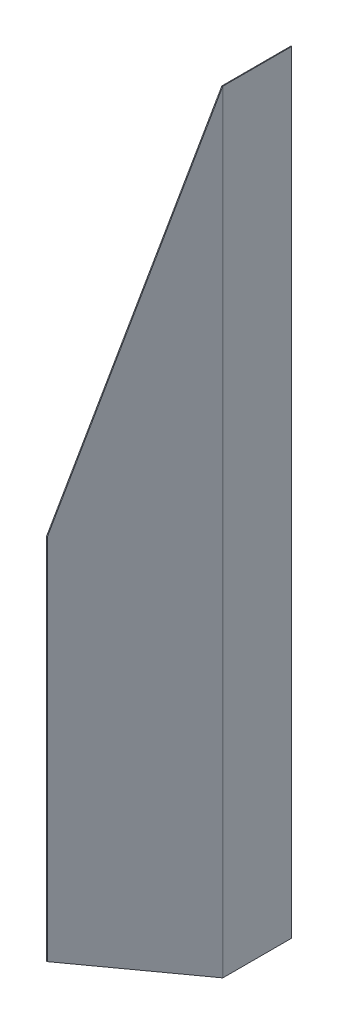
ISO-10303-21;
HEADER;
FILE_DESCRIPTION(('STEP AP214'),'2;1');
FILE_NAME('part.step','',(''),(''),'','','');
FILE_SCHEMA(('AUTOMOTIVE_DESIGN { 1 0 10303 214 1 1 1 1 }'));
ENDSEC;
DATA;
#1=APPLICATION_CONTEXT('core data for automotive mechanical design processes');
#2=APPLICATION_PROTOCOL_DEFINITION('international standard','automotive_design',2000,#1);
#3=PRODUCT_CONTEXT('',#1,'mechanical');
#4=PRODUCT('Part','Part','',(#3));
#5=PRODUCT_RELATED_PRODUCT_CATEGORY('part','',(#4));
#6=PRODUCT_DEFINITION_FORMATION('','',#4);
#7=PRODUCT_DEFINITION_CONTEXT('part definition',#1,'design');
#8=PRODUCT_DEFINITION('design','',#6,#7);
#9=PRODUCT_DEFINITION_SHAPE('','',#8);
#10=(LENGTH_UNIT() NAMED_UNIT(*) SI_UNIT(.MILLI.,.METRE.));
#11=(NAMED_UNIT(*) PLANE_ANGLE_UNIT() SI_UNIT($,.RADIAN.));
#12=(NAMED_UNIT(*) SI_UNIT($,.STERADIAN.) SOLID_ANGLE_UNIT());
#13=UNCERTAINTY_MEASURE_WITH_UNIT(LENGTH_MEASURE(1.E-05),#10,'distance_accuracy_value','');
#14=(GEOMETRIC_REPRESENTATION_CONTEXT(3) GLOBAL_UNCERTAINTY_ASSIGNED_CONTEXT((#13)) GLOBAL_UNIT_ASSIGNED_CONTEXT((#10,
#11,#12)) REPRESENTATION_CONTEXT('',''));
#15=CARTESIAN_POINT('',(0.,0.,0.));
#16=DIRECTION('',(0.,0.,1.));
#17=DIRECTION('',(1.,0.,0.));
#18=AXIS2_PLACEMENT_3D('',#15,#16,#17);
#19=CARTESIAN_POINT('',(-3.20750439329976,840.,-49.4876398968316));
#20=DIRECTION('',(0.939692620785909,0.,-0.342020143325666));
#21=DIRECTION('',(-0.342020143325666,0.,-0.93969262078591));
#22=AXIS2_PLACEMENT_3D('',#19,#20,#21);
#23=PLANE('',#22);
#24=DIRECTION('',(0.281664999513488,0.567267835166944,0.773868226014013));
#25=VECTOR('',#24,1.);
#26=CARTESIAN_POINT('',(130.992682099394,270.367874027647,319.224342178446));
#27=LINE('',#26,#25);
#28=CARTESIAN_POINT('',(-3.15925848992848,0.18847277795464,-49.3550853667378));
#29=VERTEX_POINT('',#28);
#30=CARTESIAN_POINT('',(105.98356588656,220.,250.512360103169));
#31=VERTEX_POINT('',#30);
#32=EDGE_CURVE('E125',#29,#31,#27,.T.);
#33=ORIENTED_EDGE('',*,*,#32,.T.);
#34=DIRECTION('',(0.,-1.,0.));
#35=VECTOR('',#34,1.);
#36=CARTESIAN_POINT('',(105.98356588656,840.,250.512360103169));
#37=LINE('',#36,#35);
#38=CARTESIAN_POINT('',(105.98356588656,620.,250.512360103169));
#39=VERTEX_POINT('',#38);
#40=EDGE_CURVE('E143',#39,#31,#37,.T.);
#41=ORIENTED_EDGE('',*,*,#40,.F.);
#42=DIRECTION('',(-0.281664999513488,0.567267835166944,-0.773868226014013));
#43=VECTOR('',#42,1.);
#44=CARTESIAN_POINT('',(-3.22209329431071,839.938075296945,-49.5277225729338));
#45=LINE('',#44,#43);
#46=CARTESIAN_POINT('',(-3.15925848992848,839.811527222045,-49.3550853667378));
#47=VERTEX_POINT('',#46);
#48=EDGE_CURVE('E216',#39,#47,#45,.T.);
#49=ORIENTED_EDGE('',*,*,#48,.T.);
#50=DIRECTION('',(0.,-1.,0.));
#51=VECTOR('',#50,1.);
#52=CARTESIAN_POINT('',(-3.15925848992848,840.,-49.3550853667378));
#53=LINE('',#52,#51);
#54=EDGE_CURVE('E179',#47,#29,#53,.T.);
#55=ORIENTED_EDGE('',*,*,#54,.T.);
#56=EDGE_LOOP('',(#33,#41,#49,#55));
#57=FACE_BOUND('',#56,.T.);
#58=ADVANCED_FACE('F33',(#57),#23,.F.);
#59=CARTESIAN_POINT('',(106.735319983189,840.,250.238743988508));
#60=DIRECTION('',(0.342020143325798,0.,0.939692620785862));
#61=DIRECTION('',(0.939692620785862,0.,-0.342020143325798));
#62=AXIS2_PLACEMENT_3D('',#59,#60,#61);
#63=PLANE('',#62);
#64=ORIENTED_EDGE('',*,*,#40,.T.);
#65=DIRECTION('',(-0.939692620785909,0.,0.342020143325666));
#66=VECTOR('',#65,1.);
#67=CARTESIAN_POINT('',(105.98356588656,220.,250.512360103169));
#68=LINE('',#67,#66);
#69=CARTESIAN_POINT('',(106.735319983189,220.,250.238743988508));
#70=VERTEX_POINT('',#69);
#71=EDGE_CURVE('E126',#31,#70,#68,.F.);
#72=ORIENTED_EDGE('',*,*,#71,.T.);
#73=DIRECTION('',(0.,-1.,0.));
#74=VECTOR('',#73,1.);
#75=CARTESIAN_POINT('',(106.735319983189,840.,250.238743988508));
#76=LINE('',#75,#74);
#77=CARTESIAN_POINT('',(106.735319983189,620.,250.238743988508));
#78=VERTEX_POINT('',#77);
#79=EDGE_CURVE('E135',#78,#70,#76,.T.);
#80=ORIENTED_EDGE('',*,*,#79,.F.);
#81=DIRECTION('',(-0.939692620785909,0.,0.342020143325666));
#82=VECTOR('',#81,1.);
#83=CARTESIAN_POINT('',(105.98356588656,620.,250.512360103169));
#84=LINE('',#83,#82);
#85=EDGE_CURVE('E211',#39,#78,#84,.F.);
#86=ORIENTED_EDGE('',*,*,#85,.F.);
#87=EDGE_LOOP('',(#64,#72,#80,#86));
#88=FACE_BOUND('',#87,.T.);
#89=ADVANCED_FACE('F234',(#88),#63,.T.);
#90=CARTESIAN_POINT('',(-2.45575029667103,840.,-49.7612560114921));
#91=DIRECTION('',(0.939692620785909,0.,-0.342020143325666));
#92=DIRECTION('',(-0.342020143325666,0.,-0.93969262078591));
#93=AXIS2_PLACEMENT_3D('',#90,#91,#92);
#94=PLANE('',#93);
#95=ORIENTED_EDGE('',*,*,#79,.T.);
#96=DIRECTION('',(0.281664999513488,0.567267835166944,0.773868226014013));
#97=VECTOR('',#96,1.);
#98=CARTESIAN_POINT('',(131.744436196022,270.367874027647,318.950726063786));
#99=LINE('',#98,#97);
#100=CARTESIAN_POINT('',(-2.40750439329975,0.18847277795464,-49.6287014813983));
#101=VERTEX_POINT('',#100);
#102=EDGE_CURVE('E122',#101,#70,#99,.T.);
#103=ORIENTED_EDGE('',*,*,#102,.F.);
#104=DIRECTION('',(0.,-1.,0.));
#105=VECTOR('',#104,1.);
#106=CARTESIAN_POINT('',(-2.40750439329975,840.,-49.6287014813983));
#107=LINE('',#106,#105);
#108=CARTESIAN_POINT('',(-2.40750439329975,839.811527222045,-49.6287014813983));
#109=VERTEX_POINT('',#108);
#110=EDGE_CURVE('E133',#109,#101,#107,.T.);
#111=ORIENTED_EDGE('',*,*,#110,.F.);
#112=DIRECTION('',(-0.281664999513488,0.567267835166944,-0.773868226014013));
#113=VECTOR('',#112,1.);
#114=CARTESIAN_POINT('',(-2.47033919768198,839.938075296945,-49.8013386875943));
#115=LINE('',#114,#113);
#116=EDGE_CURVE('E213',#78,#109,#115,.T.);
#117=ORIENTED_EDGE('',*,*,#116,.F.);
#118=EDGE_LOOP('',(#95,#103,#111,#117));
#119=FACE_BOUND('',#118,.T.);
#120=ADVANCED_FACE('F131',(#119),#94,.T.);
#121=CARTESIAN_POINT('',(-1.65575029667102,840.,-49.9023175960588));
#122=DIRECTION('',(0.,-1.,0.));
#123=DIRECTION('',(0.,0.,-1.));
#124=AXIS2_PLACEMENT_3D('',#121,#122,#123);
#125=CYLINDRICAL_SURFACE('',#124,0.8);
#126=ORIENTED_EDGE('',*,*,#110,.T.);
#127=CARTESIAN_POINT('',(-1.65575029667102,0.18847277795464,-49.9023175960588));
#128=DIRECTION('',(-0.27678767726329,0.587432689786256,-0.760467893264191));
#129=DIRECTION('',(-0.200913812754877,-0.809273028693336,-0.552006163800563));
#130=AXIS2_PLACEMENT_3D('',#127,#128,#129);
#131=ELLIPSE('',#130,1.36185815653379,0.8);
#132=CARTESIAN_POINT('',(-2.44322162605729,0.,-49.7612895655308));
#133=VERTEX_POINT('',#132);
#134=EDGE_CURVE('E109',#133,#101,#131,.T.);
#135=ORIENTED_EDGE('',*,*,#134,.F.);
#136=CARTESIAN_POINT('',(-1.65575029667102,0.,-49.9023175960588));
#137=DIRECTION('',(0.,-1.,0.));
#138=DIRECTION('',(0.,0.,-1.));
#139=AXIS2_PLACEMENT_3D('',#136,#137,#138);
#140=CIRCLE('',#139,0.8);
#141=CARTESIAN_POINT('',(-2.45575029667103,0.,-49.9023175960588));
#142=VERTEX_POINT('',#141);
#143=EDGE_CURVE('E200',#142,#133,#140,.F.);
#144=ORIENTED_EDGE('',*,*,#143,.F.);
#145=DIRECTION('',(0.,-1.,0.));
#146=VECTOR('',#145,1.);
#147=CARTESIAN_POINT('',(-2.45575029667103,840.,-49.9023175960588));
#148=LINE('',#147,#146);
#149=CARTESIAN_POINT('',(-2.45575029667103,840.,-49.9023175960588));
#150=VERTEX_POINT('',#149);
#151=EDGE_CURVE('E141',#150,#142,#148,.T.);
#152=ORIENTED_EDGE('',*,*,#151,.F.);
#153=CARTESIAN_POINT('',(-1.65575029667102,840.,-49.9023175960588));
#154=DIRECTION('',(0.,-1.,0.));
#155=DIRECTION('',(0.,0.,-1.));
#156=AXIS2_PLACEMENT_3D('',#153,#154,#155);
#157=CIRCLE('',#156,0.8);
#158=CARTESIAN_POINT('',(-2.44322162605727,840.,-49.7612895655307));
#159=VERTEX_POINT('',#158);
#160=EDGE_CURVE('E182',#150,#159,#157,.F.);
#161=ORIENTED_EDGE('',*,*,#160,.T.);
#162=CARTESIAN_POINT('',(-1.65575029667102,839.811527222045,-49.9023175960588));
#163=DIRECTION('',(-0.276787677263289,-0.587432689786263,-0.760467893264187));
#164=DIRECTION('',(0.20091381275488,-0.809273028693331,0.552006163800569));
#165=AXIS2_PLACEMENT_3D('',#162,#163,#164);
#166=ELLIPSE('',#165,1.36185815653378,0.8);
#167=EDGE_CURVE('E140',#109,#159,#166,.T.);
#168=ORIENTED_EDGE('',*,*,#167,.F.);
#169=EDGE_LOOP('',(#126,#135,#144,#152,#161,#168));
#170=FACE_BOUND('',#169,.T.);
#171=ADVANCED_FACE('F138',(#170),#125,.F.);
#172=CARTESIAN_POINT('',(-1.65575029667102,840.,-49.9023175960588));
#173=DIRECTION('',(0.,-1.,0.));
#174=DIRECTION('',(0.,0.,-1.));
#175=AXIS2_PLACEMENT_3D('',#172,#173,#174);
#176=CYLINDRICAL_SURFACE('',#175,1.6);
#177=CARTESIAN_POINT('',(-1.65575029667102,0.18847277795464,-49.9023175960588));
#178=DIRECTION('',(-0.194017026287838,0.823533364949477,-0.533057398715575));
#179=DIRECTION('',(-0.281664999513488,-0.567267835166944,-0.773868226014013));
#180=AXIS2_PLACEMENT_3D('',#177,#178,#179);
#181=ELLIPSE('',#180,1.94284781661294,1.6);
#182=CARTESIAN_POINT('',(-3.23069295544356,0.,-49.6202615350027));
#183=VERTEX_POINT('',#182);
#184=EDGE_CURVE('E48',#183,#29,#181,.T.);
#185=ORIENTED_EDGE('',*,*,#184,.T.);
#186=ORIENTED_EDGE('',*,*,#54,.F.);
#187=CARTESIAN_POINT('',(-1.65575029667102,839.811527222045,-49.9023175960588));
#188=DIRECTION('',(-0.194017026287838,-0.823533364949477,-0.533057398715575));
#189=DIRECTION('',(0.281664999513488,-0.567267835166944,0.773868226014013));
#190=AXIS2_PLACEMENT_3D('',#187,#188,#189);
#191=ELLIPSE('',#190,1.94284781661294,1.6);
#192=CARTESIAN_POINT('',(-3.23069295544352,840.,-49.6202615350025));
#193=VERTEX_POINT('',#192);
#194=EDGE_CURVE('E221',#47,#193,#191,.T.);
#195=ORIENTED_EDGE('',*,*,#194,.T.);
#196=CARTESIAN_POINT('',(-1.65575029667102,840.,-49.9023175960588));
#197=DIRECTION('',(0.,1.,0.));
#198=DIRECTION('',(1.,0.,0.));
#199=AXIS2_PLACEMENT_3D('',#196,#197,#198);
#200=CIRCLE('',#199,1.6);
#201=CARTESIAN_POINT('',(-3.25575029667102,840.,-49.9023175960588));
#202=VERTEX_POINT('',#201);
#203=EDGE_CURVE('E178',#202,#193,#200,.T.);
#204=ORIENTED_EDGE('',*,*,#203,.F.);
#205=DIRECTION('',(0.,-1.,0.));
#206=VECTOR('',#205,1.);
#207=CARTESIAN_POINT('',(-3.25575029667102,840.,-49.9023175960588));
#208=LINE('',#207,#206);
#209=CARTESIAN_POINT('',(-3.25575029667102,0.,-49.9023175960588));
#210=VERTEX_POINT('',#209);
#211=EDGE_CURVE('E168',#202,#210,#208,.T.);
#212=ORIENTED_EDGE('',*,*,#211,.T.);
#213=CARTESIAN_POINT('',(-1.65575029667102,0.,-49.9023175960588));
#214=DIRECTION('',(0.,1.,0.));
#215=DIRECTION('',(1.,0.,0.));
#216=AXIS2_PLACEMENT_3D('',#213,#214,#215);
#217=CIRCLE('',#216,1.6);
#218=EDGE_CURVE('E171',#210,#183,#217,.T.);
#219=ORIENTED_EDGE('',*,*,#218,.T.);
#220=EDGE_LOOP('',(#185,#186,#195,#204,#212,#219));
#221=FACE_BOUND('',#220,.T.);
#222=ADVANCED_FACE('F176',(#221),#176,.T.);
#223=CARTESIAN_POINT('',(-2.45575029667103,0.,-49.9023175960588));
#224=DIRECTION('',(0.,-1.,0.));
#225=DIRECTION('',(0.,0.,-1.));
#226=AXIS2_PLACEMENT_3D('',#223,#224,#225);
#227=PLANE('',#226);
#228=ORIENTED_EDGE('',*,*,#143,.T.);
#229=DIRECTION('',(-0.984339161732833,0.,0.176285038160089));
#230=VECTOR('',#229,1.);
#231=CARTESIAN_POINT('',(-3.23069295544356,0.,-49.6202615350027));
#232=LINE('',#231,#230);
#233=EDGE_CURVE('E113',#183,#133,#232,.F.);
#234=ORIENTED_EDGE('',*,*,#233,.F.);
#235=ORIENTED_EDGE('',*,*,#218,.F.);
#236=DIRECTION('',(-1.,0.,0.));
#237=VECTOR('',#236,1.);
#238=CARTESIAN_POINT('',(-2.45575029667103,0.,-49.9023175960588));
#239=LINE('',#238,#237);
#240=EDGE_CURVE('E41',#142,#210,#239,.T.);
#241=ORIENTED_EDGE('',*,*,#240,.F.);
#242=EDGE_LOOP('',(#228,#234,#235,#241));
#243=FACE_BOUND('',#242,.T.);
#244=ADVANCED_FACE('F181',(#243),#227,.T.);
#245=CARTESIAN_POINT('',(-2.40750439329975,840.,-49.6287014813983));
#246=DIRECTION('',(0.,1.,0.));
#247=DIRECTION('',(0.,0.,1.));
#248=AXIS2_PLACEMENT_3D('',#245,#246,#247);
#249=PLANE('',#248);
#250=ORIENTED_EDGE('',*,*,#203,.T.);
#251=DIRECTION('',(-0.984339161732809,0.,0.176285038160219));
#252=VECTOR('',#251,1.);
#253=CARTESIAN_POINT('',(-3.23069295544352,840.,-49.6202615350025));
#254=LINE('',#253,#252);
#255=EDGE_CURVE('E56',#193,#159,#254,.F.);
#256=ORIENTED_EDGE('',*,*,#255,.T.);
#257=ORIENTED_EDGE('',*,*,#160,.F.);
#258=DIRECTION('',(1.,0.,0.));
#259=VECTOR('',#258,1.);
#260=CARTESIAN_POINT('',(-3.25575029667102,840.,-49.9023175960588));
#261=LINE('',#260,#259);
#262=EDGE_CURVE('E11',#202,#150,#261,.T.);
#263=ORIENTED_EDGE('',*,*,#262,.F.);
#264=EDGE_LOOP('',(#250,#256,#257,#263));
#265=FACE_BOUND('',#264,.T.);
#266=ADVANCED_FACE('F35',(#265),#249,.T.);
#267=CARTESIAN_POINT('',(-3.15925848992848,0.,-49.3550853667378));
#268=DIRECTION('',(0.,-1.,0.));
#269=DIRECTION('',(0.,0.,-1.));
#270=AXIS2_PLACEMENT_3D('',#267,#268,#269);
#271=PLANE('',#270);
#272=DIRECTION('',(0.,0.,1.));
#273=VECTOR('',#272,1.);
#274=CARTESIAN_POINT('',(-2.45575029667103,0.,-124.761256011492));
#275=LINE('',#274,#273);
#276=CARTESIAN_POINT('',(-2.45575029667103,0.,-124.761256011492));
#277=VERTEX_POINT('',#276);
#278=EDGE_CURVE('E160',#277,#142,#275,.T.);
#279=ORIENTED_EDGE('',*,*,#278,.T.);
#280=ORIENTED_EDGE('',*,*,#240,.T.);
#281=DIRECTION('',(0.,0.,1.));
#282=VECTOR('',#281,1.);
#283=CARTESIAN_POINT('',(-3.25575029667103,0.,-124.761256011492));
#284=LINE('',#283,#282);
#285=CARTESIAN_POINT('',(-3.25575029667103,0.,-124.761256011492));
#286=VERTEX_POINT('',#285);
#287=EDGE_CURVE('E157',#286,#210,#284,.T.);
#288=ORIENTED_EDGE('',*,*,#287,.F.);
#289=DIRECTION('',(1.,0.,0.));
#290=VECTOR('',#289,1.);
#291=CARTESIAN_POINT('',(-3.25575029667103,0.,-124.761256011492));
#292=LINE('',#291,#290);
#293=EDGE_CURVE('E172',#286,#277,#292,.T.);
#294=ORIENTED_EDGE('',*,*,#293,.T.);
#295=EDGE_LOOP('',(#279,#280,#288,#294));
#296=FACE_BOUND('',#295,.T.);
#297=ADVANCED_FACE('F155',(#296),#271,.T.);
#298=CARTESIAN_POINT('',(-2.45575029667103,840.,-124.761256011492));
#299=DIRECTION('',(1.,0.,0.));
#300=DIRECTION('',(0.,0.,-1.));
#301=AXIS2_PLACEMENT_3D('',#298,#299,#300);
#302=PLANE('',#301);
#303=ORIENTED_EDGE('',*,*,#278,.F.);
#304=DIRECTION('',(0.,-1.,0.));
#305=VECTOR('',#304,1.);
#306=CARTESIAN_POINT('',(-2.45575029667103,840.,-124.761256011492));
#307=LINE('',#306,#305);
#308=CARTESIAN_POINT('',(-2.45575029667103,840.,-124.761256011492));
#309=VERTEX_POINT('',#308);
#310=EDGE_CURVE('E146',#309,#277,#307,.T.);
#311=ORIENTED_EDGE('',*,*,#310,.F.);
#312=DIRECTION('',(0.,0.,1.));
#313=VECTOR('',#312,1.);
#314=CARTESIAN_POINT('',(-2.45575029667103,840.,-124.761256011492));
#315=LINE('',#314,#313);
#316=EDGE_CURVE('E184',#309,#150,#315,.T.);
#317=ORIENTED_EDGE('',*,*,#316,.T.);
#318=ORIENTED_EDGE('',*,*,#151,.T.);
#319=EDGE_LOOP('',(#303,#311,#317,#318));
#320=FACE_BOUND('',#319,.T.);
#321=ADVANCED_FACE('F198',(#320),#302,.T.);
#322=CARTESIAN_POINT('',(-3.25575029667103,840.,-124.761256011492));
#323=DIRECTION('',(0.,0.,-1.));
#324=DIRECTION('',(-1.,0.,0.));
#325=AXIS2_PLACEMENT_3D('',#322,#323,#324);
#326=PLANE('',#325);
#327=ORIENTED_EDGE('',*,*,#293,.F.);
#328=DIRECTION('',(0.,-1.,0.));
#329=VECTOR('',#328,1.);
#330=CARTESIAN_POINT('',(-3.25575029667103,840.,-124.761256011492));
#331=LINE('',#330,#329);
#332=CARTESIAN_POINT('',(-3.25575029667103,840.,-124.761256011492));
#333=VERTEX_POINT('',#332);
#334=EDGE_CURVE('E170',#333,#286,#331,.T.);
#335=ORIENTED_EDGE('',*,*,#334,.F.);
#336=DIRECTION('',(1.,0.,0.));
#337=VECTOR('',#336,1.);
#338=CARTESIAN_POINT('',(-3.25575029667103,840.,-124.761256011492));
#339=LINE('',#338,#337);
#340=EDGE_CURVE('E194',#333,#309,#339,.T.);
#341=ORIENTED_EDGE('',*,*,#340,.T.);
#342=ORIENTED_EDGE('',*,*,#310,.T.);
#343=EDGE_LOOP('',(#327,#335,#341,#342));
#344=FACE_BOUND('',#343,.T.);
#345=ADVANCED_FACE('F192',(#344),#326,.T.);
#346=CARTESIAN_POINT('',(-3.25575029667103,840.,-124.761256011492));
#347=DIRECTION('',(1.,0.,0.));
#348=DIRECTION('',(0.,0.,-1.));
#349=AXIS2_PLACEMENT_3D('',#346,#347,#348);
#350=PLANE('',#349);
#351=ORIENTED_EDGE('',*,*,#287,.T.);
#352=ORIENTED_EDGE('',*,*,#211,.F.);
#353=DIRECTION('',(0.,0.,1.));
#354=VECTOR('',#353,1.);
#355=CARTESIAN_POINT('',(-3.25575029667103,840.,-124.761256011492));
#356=LINE('',#355,#354);
#357=EDGE_CURVE('E206',#333,#202,#356,.T.);
#358=ORIENTED_EDGE('',*,*,#357,.F.);
#359=ORIENTED_EDGE('',*,*,#334,.T.);
#360=EDGE_LOOP('',(#351,#352,#358,#359));
#361=FACE_BOUND('',#360,.T.);
#362=ADVANCED_FACE('F166',(#361),#350,.F.);
#363=CARTESIAN_POINT('',(-1.65575029667102,840.,-49.9023175960588));
#364=DIRECTION('',(0.,-1.,0.));
#365=DIRECTION('',(0.,0.,-1.));
#366=AXIS2_PLACEMENT_3D('',#363,#364,#365);
#367=PLANE('',#366);
#368=ORIENTED_EDGE('',*,*,#357,.T.);
#369=ORIENTED_EDGE('',*,*,#262,.T.);
#370=ORIENTED_EDGE('',*,*,#316,.F.);
#371=ORIENTED_EDGE('',*,*,#340,.F.);
#372=EDGE_LOOP('',(#368,#369,#370,#371));
#373=FACE_BOUND('',#372,.T.);
#374=ADVANCED_FACE('F258',(#373),#367,.F.);
#375=CARTESIAN_POINT('',(-3.22209329431071,839.938075296945,-49.5277225729338));
#376=DIRECTION('',(-0.194017026287838,-0.823533364949477,-0.533057398715575));
#377=DIRECTION('',(-0.281664999513488,0.567267835166944,-0.773868226014013));
#378=AXIS2_PLACEMENT_3D('',#375,#376,#377);
#379=PLANE('',#378);
#380=DIRECTION('',(-0.939692620785909,0.,0.342020143325666));
#381=VECTOR('',#380,1.);
#382=CARTESIAN_POINT('',(-3.15925848992848,839.811527222045,-49.3550853667378));
#383=LINE('',#382,#381);
#384=EDGE_CURVE('E204',#47,#109,#383,.F.);
#385=ORIENTED_EDGE('',*,*,#384,.F.);
#386=ORIENTED_EDGE('',*,*,#48,.F.);
#387=ORIENTED_EDGE('',*,*,#85,.T.);
#388=ORIENTED_EDGE('',*,*,#116,.T.);
#389=EDGE_LOOP('',(#385,#386,#387,#388));
#390=FACE_BOUND('',#389,.T.);
#391=ADVANCED_FACE('F232',(#390),#379,.F.);
#392=CARTESIAN_POINT('',(-1.38213418201049,838.709412147057,-49.1505634994301));
#393=CARTESIAN_POINT('',(-1.29092881045698,838.709412147057,-48.8999788005539));
#394=CARTESIAN_POINT('',(-1.19972343890347,838.709412147057,-48.6493941016776));
#395=CARTESIAN_POINT('',(-1.10851806734996,838.709412147057,-48.3988094028014));
#396=CARTESIAN_POINT('',(-2.88564237526795,838.709412147057,-48.6033312701091));
#397=CARTESIAN_POINT('',(-3.29560640146692,838.709412147057,-48.1703358281258));
#398=CARTESIAN_POINT('',(-3.7055704276659,838.709412147057,-47.7373403861425));
#399=CARTESIAN_POINT('',(-4.11553445386487,838.709412147057,-47.3043449441593));
#400=CARTESIAN_POINT('',(-3.43287460458901,840.913642297034,-50.1068394633665));
#401=CARTESIAN_POINT('',(-4.02524937389501,840.913642297035,-50.1750134191357));
#402=CARTESIAN_POINT('',(-4.61762414320101,840.913642297035,-50.2431873749049));
#403=CARTESIAN_POINT('',(-5.209998912507,840.913642297034,-50.3113613306742));
#404=CARTESIAN_POINT('',(-1.92936641133156,840.913642297034,-50.6540716926876));
#405=CARTESIAN_POINT('',(-2.02057178288507,840.913642297034,-50.9046563915638));
#406=CARTESIAN_POINT('',(-2.11177715443858,840.913642297034,-51.1552410904401));
#407=CARTESIAN_POINT('',(-2.20298252599209,840.913642297034,-51.4058257893163));
#408=CARTESIAN_POINT('',(-0.425858218074103,840.913642297034,-51.2013039220086));
#409=CARTESIAN_POINT('',(-0.0158941918751291,840.913642297035,-51.6342993639919));
#410=CARTESIAN_POINT('',(0.394069834323845,840.913642297035,-52.0672948059752));
#411=CARTESIAN_POINT('',(0.804033860522819,840.913642297034,-52.5002902479584));
#412=CARTESIAN_POINT('',(0.121374011246963,838.709412147057,-49.6977957287512));
#413=CARTESIAN_POINT('',(0.71374878055296,838.709412147057,-49.629621772982));
#414=CARTESIAN_POINT('',(1.30612354985896,838.709412147057,-49.5614478172128));
#415=CARTESIAN_POINT('',(1.89849831916495,838.709412147057,-49.4932738614435));
#416=CARTESIAN_POINT('',(-1.38213418201049,838.709412147057,-49.1505634994301));
#417=CARTESIAN_POINT('',(-1.29092881045698,838.709412147057,-48.8999788005539));
#418=CARTESIAN_POINT('',(-1.19972343890347,838.709412147057,-48.6493941016776));
#419=CARTESIAN_POINT('',(-1.10851806734996,838.709412147057,-48.3988094028014));
#420=(BOUNDED_SURFACE() B_SPLINE_SURFACE(3,3,((#392,#393,#394,#395),(#396,#397,#398,#399),(#400,
#401,#402,#403),(#404,#405,#406,#407),(#408,#409,#410,#411),(#412,#413,#414,#415),(#416,#417,
#418,#419)),.UNSPECIFIED.,.T.,.F.,.F.) B_SPLINE_SURFACE_WITH_KNOTS((4,3,4),(4,4),(0.,0.5,1.),
(0.,1.),.UNSPECIFIED.) GEOMETRIC_REPRESENTATION_ITEM() RATIONAL_B_SPLINE_SURFACE(((1.,1.,1.,1.),
(0.333333333333333,0.333333333333333,0.333333333333333,0.333333333333333),(0.333333333333333,
0.333333333333333,0.333333333333333,0.333333333333333),(1.,1.,1.,1.),(0.333333333333333,
0.333333333333333,0.333333333333333,0.333333333333333),(0.333333333333333,0.333333333333333,
0.333333333333333,0.333333333333333),(1.,1.,1.,1.))) REPRESENTATION_ITEM('') SURFACE());
#421=ORIENTED_EDGE('',*,*,#255,.F.);
#422=ORIENTED_EDGE('',*,*,#194,.F.);
#423=ORIENTED_EDGE('',*,*,#384,.T.);
#424=ORIENTED_EDGE('',*,*,#167,.T.);
#425=EDGE_LOOP('',(#421,#422,#423,#424));
#426=FACE_BOUND('',#425,.T.);
#427=ADVANCED_FACE('F290',(#426),#420,.T.);
#428=CARTESIAN_POINT('',(130.992682099394,270.367874027647,319.224342178446));
#429=DIRECTION('',(-0.194017026287838,0.823533364949477,-0.533057398715575));
#430=DIRECTION('',(0.281664999513488,0.567267835166944,0.773868226014013));
#431=AXIS2_PLACEMENT_3D('',#428,#429,#430);
#432=PLANE('',#431);
#433=ORIENTED_EDGE('',*,*,#71,.F.);
#434=ORIENTED_EDGE('',*,*,#32,.F.);
#435=DIRECTION('',(-0.939692620785909,0.,0.342020143325666));
#436=VECTOR('',#435,1.);
#437=CARTESIAN_POINT('',(-3.15925848992848,0.18847277795464,-49.3550853667378));
#438=LINE('',#437,#436);
#439=EDGE_CURVE('E112',#29,#101,#438,.F.);
#440=ORIENTED_EDGE('',*,*,#439,.T.);
#441=ORIENTED_EDGE('',*,*,#102,.T.);
#442=EDGE_LOOP('',(#433,#434,#440,#441));
#443=FACE_BOUND('',#442,.T.);
#444=ADVANCED_FACE('F121',(#443),#432,.F.);
#445=CARTESIAN_POINT('',(-1.92936641133156,-0.913642297034187,-50.6540716926876));
#446=CARTESIAN_POINT('',(-2.02057178288507,-0.913642297034193,-50.9046563915638));
#447=CARTESIAN_POINT('',(-2.11177715443858,-0.9136422970342,-51.1552410904401));
#448=CARTESIAN_POINT('',(-2.20298252599209,-0.913642297034206,-51.4058257893163));
#449=CARTESIAN_POINT('',(-3.43287460458901,-0.913642297034186,-50.1068394633665));
#450=CARTESIAN_POINT('',(-4.02524937389501,-0.913642297034193,-50.1750134191357));
#451=CARTESIAN_POINT('',(-4.61762414320101,-0.913642297034199,-50.2431873749049));
#452=CARTESIAN_POINT('',(-5.209998912507,-0.913642297034205,-50.3113613306742));
#453=CARTESIAN_POINT('',(-2.88564237526795,1.29058785294347,-48.6033312701091));
#454=CARTESIAN_POINT('',(-3.29560640146692,1.29058785294348,-48.1703358281258));
#455=CARTESIAN_POINT('',(-3.70557042766589,1.29058785294348,-47.7373403861425));
#456=CARTESIAN_POINT('',(-4.11553445386487,1.29058785294349,-47.3043449441593));
#457=CARTESIAN_POINT('',(-1.38213418201049,1.29058785294347,-49.1505634994301));
#458=CARTESIAN_POINT('',(-1.29092881045698,1.29058785294347,-48.8999788005539));
#459=CARTESIAN_POINT('',(-1.19972343890347,1.29058785294348,-48.6493941016776));
#460=CARTESIAN_POINT('',(-1.10851806734996,1.29058785294349,-48.3988094028014));
#461=CARTESIAN_POINT('',(0.121374011246963,1.29058785294347,-49.6977957287512));
#462=CARTESIAN_POINT('',(0.713748780552959,1.29058785294347,-49.629621772982));
#463=CARTESIAN_POINT('',(1.30612354985896,1.29058785294348,-49.5614478172128));
#464=CARTESIAN_POINT('',(1.89849831916495,1.29058785294349,-49.4932738614435));
#465=CARTESIAN_POINT('',(-0.425858218074103,-0.913642297034188,-51.2013039220086));
#466=CARTESIAN_POINT('',(-0.0158941918751294,-0.913642297034195,-51.6342993639919));
#467=CARTESIAN_POINT('',(0.394069834323844,-0.913642297034202,-52.0672948059752));
#468=CARTESIAN_POINT('',(0.804033860522818,-0.913642297034208,-52.5002902479584));
#469=CARTESIAN_POINT('',(-1.92936641133156,-0.913642297034187,-50.6540716926876));
#470=CARTESIAN_POINT('',(-2.02057178288507,-0.913642297034193,-50.9046563915638));
#471=CARTESIAN_POINT('',(-2.11177715443858,-0.9136422970342,-51.1552410904401));
#472=CARTESIAN_POINT('',(-2.20298252599209,-0.913642297034206,-51.4058257893163));
#473=(BOUNDED_SURFACE() B_SPLINE_SURFACE(3,3,((#445,#446,#447,#448),(#449,#450,#451,#452),(#453,
#454,#455,#456),(#457,#458,#459,#460),(#461,#462,#463,#464),(#465,#466,#467,#468),(#469,#470,
#471,#472)),.UNSPECIFIED.,.T.,.F.,.F.) B_SPLINE_SURFACE_WITH_KNOTS((4,3,4),(4,4),(0.,0.5,1.),
(0.,1.),.UNSPECIFIED.) GEOMETRIC_REPRESENTATION_ITEM() RATIONAL_B_SPLINE_SURFACE(((1.,1.,1.,1.),
(0.333333333333333,0.333333333333333,0.333333333333333,0.333333333333333),(0.333333333333333,
0.333333333333333,0.333333333333333,0.333333333333333),(1.,1.,1.,1.),(0.333333333333333,
0.333333333333333,0.333333333333333,0.333333333333333),(0.333333333333333,0.333333333333333,
0.333333333333333,0.333333333333333),(1.,1.,1.,1.))) REPRESENTATION_ITEM('') SURFACE());
#474=ORIENTED_EDGE('',*,*,#439,.F.);
#475=ORIENTED_EDGE('',*,*,#184,.F.);
#476=ORIENTED_EDGE('',*,*,#233,.T.);
#477=ORIENTED_EDGE('',*,*,#134,.T.);
#478=EDGE_LOOP('',(#474,#475,#476,#477));
#479=FACE_BOUND('',#478,.T.);
#480=ADVANCED_FACE('F111',(#479),#473,.T.);
#481=CLOSED_SHELL('',(#58,#89,#120,#171,#222,#244,#266,#297,#321,#345,#362,#374,#391,#427,#444,#480));
#482=MANIFOLD_SOLID_BREP('B2',#481);
#483=ADVANCED_BREP_SHAPE_REPRESENTATION('',(#18,#482),#14);
#484=SHAPE_DEFINITION_REPRESENTATION(#9,#483);
ENDSEC;
END-ISO-10303-21;
